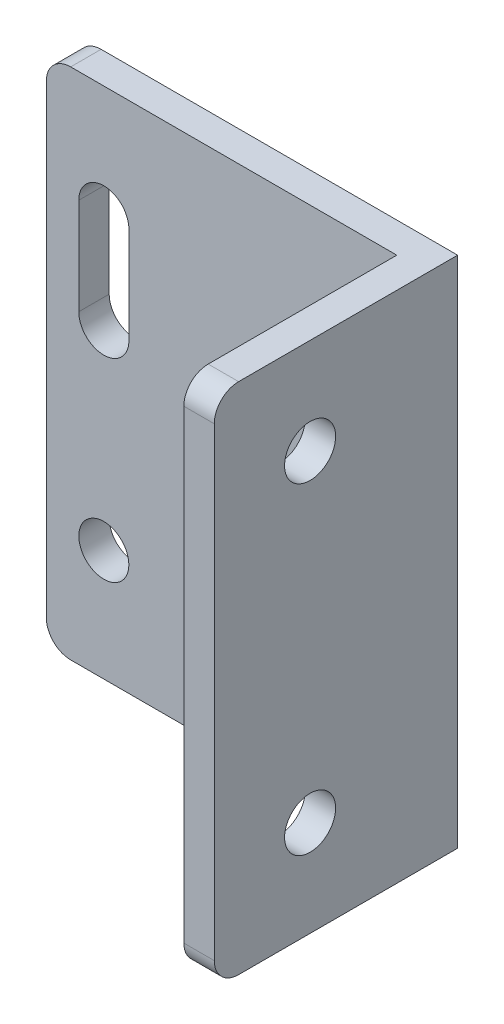
ISO-10303-21;
HEADER;
FILE_DESCRIPTION(('STEP AP214'),'2;1');
FILE_NAME('part.step','',(''),(''),'','','');
FILE_SCHEMA(('AUTOMOTIVE_DESIGN { 1 0 10303 214 1 1 1 1 }'));
ENDSEC;
DATA;
#1=APPLICATION_CONTEXT('core data for automotive mechanical design processes');
#2=APPLICATION_PROTOCOL_DEFINITION('international standard','automotive_design',2000,#1);
#3=PRODUCT_CONTEXT('',#1,'mechanical');
#4=PRODUCT('Part','Part','',(#3));
#5=PRODUCT_RELATED_PRODUCT_CATEGORY('part','',(#4));
#6=PRODUCT_DEFINITION_FORMATION('','',#4);
#7=PRODUCT_DEFINITION_CONTEXT('part definition',#1,'design');
#8=PRODUCT_DEFINITION('design','',#6,#7);
#9=PRODUCT_DEFINITION_SHAPE('','',#8);
#10=(LENGTH_UNIT() NAMED_UNIT(*) SI_UNIT(.MILLI.,.METRE.));
#11=(NAMED_UNIT(*) PLANE_ANGLE_UNIT() SI_UNIT($,.RADIAN.));
#12=(NAMED_UNIT(*) SI_UNIT($,.STERADIAN.) SOLID_ANGLE_UNIT());
#13=UNCERTAINTY_MEASURE_WITH_UNIT(LENGTH_MEASURE(1.E-05),#10,'distance_accuracy_value','');
#14=(GEOMETRIC_REPRESENTATION_CONTEXT(3) GLOBAL_UNCERTAINTY_ASSIGNED_CONTEXT((#13)) GLOBAL_UNIT_ASSIGNED_CONTEXT((#10,
#11,#12)) REPRESENTATION_CONTEXT('',''));
#15=CARTESIAN_POINT('',(0.,0.,0.));
#16=DIRECTION('',(0.,0.,1.));
#17=DIRECTION('',(1.,0.,0.));
#18=AXIS2_PLACEMENT_3D('',#15,#16,#17);
#19=CARTESIAN_POINT('',(-39.750583696,9.99999999999966,15.4));
#20=DIRECTION('',(1.,0.,0.));
#21=DIRECTION('',(0.,0.,-1.));
#22=AXIS2_PLACEMENT_3D('',#19,#20,#21);
#23=CYLINDRICAL_SURFACE('',#22,2.665);
#24=CARTESIAN_POINT('',(-3.175,9.99999999999966,15.4));
#25=DIRECTION('',(1.,0.,0.));
#26=DIRECTION('',(0.,0.,-1.));
#27=AXIS2_PLACEMENT_3D('',#24,#25,#26);
#28=CIRCLE('',#27,2.665);
#29=CARTESIAN_POINT('',(-3.175,9.99999999999966,12.735));
#30=VERTEX_POINT('',#29);
#31=EDGE_CURVE('E20',#30,#30,#28,.F.);
#32=ORIENTED_EDGE('',*,*,#31,.T.);
#33=EDGE_LOOP('',(#32));
#34=FACE_BOUND('',#33,.T.);
#35=CARTESIAN_POINT('',(0.,9.99999999999966,15.4));
#36=DIRECTION('',(1.,0.,0.));
#37=DIRECTION('',(0.,0.,-1.));
#38=AXIS2_PLACEMENT_3D('',#35,#36,#37);
#39=CIRCLE('',#38,2.665);
#40=CARTESIAN_POINT('',(0.,9.99999999999966,12.735));
#41=VERTEX_POINT('',#40);
#42=EDGE_CURVE('E190',#41,#41,#39,.T.);
#43=ORIENTED_EDGE('',*,*,#42,.T.);
#44=EDGE_LOOP('',(#43));
#45=FACE_BOUND('',#44,.T.);
#46=ADVANCED_FACE('F17',(#34,#45),#23,.F.);
#47=CARTESIAN_POINT('',(-39.750583696,43.6,15.4));
#48=DIRECTION('',(1.,0.,0.));
#49=DIRECTION('',(0.,0.,-1.));
#50=AXIS2_PLACEMENT_3D('',#47,#48,#49);
#51=CYLINDRICAL_SURFACE('',#50,2.665);
#52=CARTESIAN_POINT('',(-3.175,43.6,15.4));
#53=DIRECTION('',(1.,0.,0.));
#54=DIRECTION('',(0.,0.,-1.));
#55=AXIS2_PLACEMENT_3D('',#52,#53,#54);
#56=CIRCLE('',#55,2.665);
#57=CARTESIAN_POINT('',(-3.175,43.6,12.735));
#58=VERTEX_POINT('',#57);
#59=EDGE_CURVE('E119',#58,#58,#56,.F.);
#60=ORIENTED_EDGE('',*,*,#59,.T.);
#61=EDGE_LOOP('',(#60));
#62=FACE_BOUND('',#61,.T.);
#63=CARTESIAN_POINT('',(0.,43.6,15.4));
#64=DIRECTION('',(1.,0.,0.));
#65=DIRECTION('',(0.,0.,-1.));
#66=AXIS2_PLACEMENT_3D('',#63,#64,#65);
#67=CIRCLE('',#66,2.665);
#68=CARTESIAN_POINT('',(0.,43.6,12.735));
#69=VERTEX_POINT('',#68);
#70=EDGE_CURVE('E187',#69,#69,#67,.T.);
#71=ORIENTED_EDGE('',*,*,#70,.T.);
#72=EDGE_LOOP('',(#71));
#73=FACE_BOUND('',#72,.T.);
#74=ADVANCED_FACE('F384',(#62,#73),#51,.F.);
#75=CARTESIAN_POINT('',(0.,53.6,25.4));
#76=DIRECTION('',(0.,0.,-1.));
#77=DIRECTION('',(-1.,0.,0.));
#78=AXIS2_PLACEMENT_3D('',#75,#76,#77);
#79=PLANE('',#78);
#80=DIRECTION('',(-1.,0.,0.));
#81=VECTOR('',#80,1.);
#82=CARTESIAN_POINT('',(0.,2.54,25.4));
#83=LINE('',#82,#81);
#84=CARTESIAN_POINT('',(0.,2.54,25.4));
#85=VERTEX_POINT('',#84);
#86=CARTESIAN_POINT('',(-3.175,2.54,25.4));
#87=VERTEX_POINT('',#86);
#88=EDGE_CURVE('E145',#85,#87,#83,.T.);
#89=ORIENTED_EDGE('',*,*,#88,.F.);
#90=DIRECTION('',(0.,1.,0.));
#91=VECTOR('',#90,1.);
#92=CARTESIAN_POINT('',(0.,53.6,25.4));
#93=LINE('',#92,#91);
#94=CARTESIAN_POINT('',(0.,51.06,25.4));
#95=VERTEX_POINT('',#94);
#96=EDGE_CURVE('E185',#85,#95,#93,.T.);
#97=ORIENTED_EDGE('',*,*,#96,.T.);
#98=DIRECTION('',(1.,0.,0.));
#99=VECTOR('',#98,1.);
#100=CARTESIAN_POINT('',(0.,51.06,25.4));
#101=LINE('',#100,#99);
#102=CARTESIAN_POINT('',(-3.175,51.06,25.4));
#103=VERTEX_POINT('',#102);
#104=EDGE_CURVE('E147',#103,#95,#101,.T.);
#105=ORIENTED_EDGE('',*,*,#104,.F.);
#106=DIRECTION('',(0.,1.,0.));
#107=VECTOR('',#106,1.);
#108=CARTESIAN_POINT('',(-3.175,53.6,25.4));
#109=LINE('',#108,#107);
#110=EDGE_CURVE('E116',#103,#87,#109,.F.);
#111=ORIENTED_EDGE('',*,*,#110,.T.);
#112=EDGE_LOOP('',(#89,#97,#105,#111));
#113=FACE_BOUND('',#112,.T.);
#114=ADVANCED_FACE('F376',(#113),#79,.F.);
#115=CARTESIAN_POINT('',(0.,51.06,22.86));
#116=DIRECTION('',(1.,0.,0.));
#117=DIRECTION('',(0.,0.,-1.));
#118=AXIS2_PLACEMENT_3D('',#115,#116,#117);
#119=CYLINDRICAL_SURFACE('',#118,2.54);
#120=CARTESIAN_POINT('',(0.,51.06,22.86));
#121=DIRECTION('',(1.,0.,0.));
#122=DIRECTION('',(0.,0.,-1.));
#123=AXIS2_PLACEMENT_3D('',#120,#121,#122);
#124=CIRCLE('',#123,2.54);
#125=CARTESIAN_POINT('',(0.,53.6,22.86));
#126=VERTEX_POINT('',#125);
#127=EDGE_CURVE('E135',#95,#126,#124,.F.);
#128=ORIENTED_EDGE('',*,*,#127,.T.);
#129=DIRECTION('',(1.,0.,0.));
#130=VECTOR('',#129,1.);
#131=CARTESIAN_POINT('',(0.,53.6,22.86));
#132=LINE('',#131,#130);
#133=CARTESIAN_POINT('',(-3.175,53.6,22.86));
#134=VERTEX_POINT('',#133);
#135=EDGE_CURVE('E126',#126,#134,#132,.F.);
#136=ORIENTED_EDGE('',*,*,#135,.T.);
#137=CARTESIAN_POINT('',(-3.175,51.06,22.86));
#138=DIRECTION('',(1.,0.,0.));
#139=DIRECTION('',(0.,0.,-1.));
#140=AXIS2_PLACEMENT_3D('',#137,#138,#139);
#141=CIRCLE('',#140,2.54);
#142=EDGE_CURVE('E108',#134,#103,#141,.T.);
#143=ORIENTED_EDGE('',*,*,#142,.T.);
#144=ORIENTED_EDGE('',*,*,#104,.T.);
#145=EDGE_LOOP('',(#128,#136,#143,#144));
#146=FACE_BOUND('',#145,.T.);
#147=ADVANCED_FACE('F133',(#146),#119,.T.);
#148=CARTESIAN_POINT('',(0.,2.54,22.86));
#149=DIRECTION('',(-1.,0.,0.));
#150=DIRECTION('',(0.,0.,1.));
#151=AXIS2_PLACEMENT_3D('',#148,#149,#150);
#152=CYLINDRICAL_SURFACE('',#151,2.54);
#153=CARTESIAN_POINT('',(0.,2.54,22.86));
#154=DIRECTION('',(-1.,0.,0.));
#155=DIRECTION('',(0.,0.,1.));
#156=AXIS2_PLACEMENT_3D('',#153,#154,#155);
#157=CIRCLE('',#156,2.54);
#158=CARTESIAN_POINT('',(0.,0.,22.86));
#159=VERTEX_POINT('',#158);
#160=EDGE_CURVE('E182',#159,#85,#157,.T.);
#161=ORIENTED_EDGE('',*,*,#160,.T.);
#162=ORIENTED_EDGE('',*,*,#88,.T.);
#163=CARTESIAN_POINT('',(-3.175,2.54,22.86));
#164=DIRECTION('',(-1.,0.,0.));
#165=DIRECTION('',(0.,0.,1.));
#166=AXIS2_PLACEMENT_3D('',#163,#164,#165);
#167=CIRCLE('',#166,2.54);
#168=CARTESIAN_POINT('',(-3.175,0.,22.86));
#169=VERTEX_POINT('',#168);
#170=EDGE_CURVE('E201',#87,#169,#167,.F.);
#171=ORIENTED_EDGE('',*,*,#170,.T.);
#172=DIRECTION('',(1.,0.,0.));
#173=VECTOR('',#172,1.);
#174=CARTESIAN_POINT('',(0.,0.,22.86));
#175=LINE('',#174,#173);
#176=EDGE_CURVE('E416',#159,#169,#175,.F.);
#177=ORIENTED_EDGE('',*,*,#176,.F.);
#178=EDGE_LOOP('',(#161,#162,#171,#177));
#179=FACE_BOUND('',#178,.T.);
#180=ADVANCED_FACE('F213',(#179),#152,.T.);
#181=CARTESIAN_POINT('',(-3.175,53.6,3.175));
#182=DIRECTION('',(1.,0.,0.));
#183=DIRECTION('',(0.,0.,-1.));
#184=AXIS2_PLACEMENT_3D('',#181,#182,#183);
#185=PLANE('',#184);
#186=ORIENTED_EDGE('',*,*,#170,.F.);
#187=ORIENTED_EDGE('',*,*,#110,.F.);
#188=ORIENTED_EDGE('',*,*,#142,.F.);
#189=DIRECTION('',(0.,0.,-1.));
#190=VECTOR('',#189,1.);
#191=CARTESIAN_POINT('',(-3.175,53.6,0.));
#192=LINE('',#191,#190);
#193=CARTESIAN_POINT('',(-3.175,53.6,3.175));
#194=VERTEX_POINT('',#193);
#195=EDGE_CURVE('E114',#134,#194,#192,.T.);
#196=ORIENTED_EDGE('',*,*,#195,.T.);
#197=DIRECTION('',(0.,1.,0.));
#198=VECTOR('',#197,1.);
#199=CARTESIAN_POINT('',(-3.175,53.6,3.175));
#200=LINE('',#199,#198);
#201=CARTESIAN_POINT('',(-3.175,0.,3.175));
#202=VERTEX_POINT('',#201);
#203=EDGE_CURVE('E200',#194,#202,#200,.F.);
#204=ORIENTED_EDGE('',*,*,#203,.T.);
#205=DIRECTION('',(0.,0.,-1.));
#206=VECTOR('',#205,1.);
#207=CARTESIAN_POINT('',(-3.175,0.,0.));
#208=LINE('',#207,#206);
#209=EDGE_CURVE('E419',#169,#202,#208,.T.);
#210=ORIENTED_EDGE('',*,*,#209,.F.);
#211=EDGE_LOOP('',(#186,#187,#188,#196,#204,#210));
#212=FACE_BOUND('',#211,.T.);
#213=ORIENTED_EDGE('',*,*,#59,.F.);
#214=EDGE_LOOP('',(#213));
#215=FACE_BOUND('',#214,.T.);
#216=ORIENTED_EDGE('',*,*,#31,.F.);
#217=EDGE_LOOP('',(#216));
#218=FACE_BOUND('',#217,.T.);
#219=ADVANCED_FACE('F111',(#212,#215,#218),#185,.F.);
#220=CARTESIAN_POINT('',(-3.175,53.6,3.175));
#221=DIRECTION('',(0.,0.,-1.));
#222=DIRECTION('',(-1.,0.,0.));
#223=AXIS2_PLACEMENT_3D('',#220,#221,#222);
#224=PLANE('',#223);
#225=CARTESIAN_POINT('',(-37.209583696,2.54,3.175));
#226=DIRECTION('',(0.,0.,-1.));
#227=DIRECTION('',(-1.,0.,0.));
#228=AXIS2_PLACEMENT_3D('',#225,#226,#227);
#229=CIRCLE('',#228,2.54);
#230=CARTESIAN_POINT('',(-37.209583696,0.,3.175));
#231=VERTEX_POINT('',#230);
#232=CARTESIAN_POINT('',(-39.749583696,2.54,3.175));
#233=VERTEX_POINT('',#232);
#234=EDGE_CURVE('E176',#231,#233,#229,.T.);
#235=ORIENTED_EDGE('',*,*,#234,.F.);
#236=DIRECTION('',(1.,0.,0.));
#237=VECTOR('',#236,1.);
#238=CARTESIAN_POINT('',(0.,0.,3.175));
#239=LINE('',#238,#237);
#240=EDGE_CURVE('E422',#202,#231,#239,.F.);
#241=ORIENTED_EDGE('',*,*,#240,.F.);
#242=ORIENTED_EDGE('',*,*,#203,.F.);
#243=DIRECTION('',(1.,0.,0.));
#244=VECTOR('',#243,1.);
#245=CARTESIAN_POINT('',(0.,53.6,3.175));
#246=LINE('',#245,#244);
#247=CARTESIAN_POINT('',(-37.209583696,53.6,3.175));
#248=VERTEX_POINT('',#247);
#249=EDGE_CURVE('E130',#194,#248,#246,.F.);
#250=ORIENTED_EDGE('',*,*,#249,.T.);
#251=CARTESIAN_POINT('',(-37.209583696,51.06,3.175));
#252=DIRECTION('',(0.,0.,1.));
#253=DIRECTION('',(1.,0.,0.));
#254=AXIS2_PLACEMENT_3D('',#251,#252,#253);
#255=CIRCLE('',#254,2.54);
#256=CARTESIAN_POINT('',(-39.749583696,51.06,3.175));
#257=VERTEX_POINT('',#256);
#258=EDGE_CURVE('E131',#257,#248,#255,.F.);
#259=ORIENTED_EDGE('',*,*,#258,.F.);
#260=DIRECTION('',(0.,1.,0.));
#261=VECTOR('',#260,1.);
#262=CARTESIAN_POINT('',(-39.749583696,53.6,3.175));
#263=LINE('',#262,#261);
#264=EDGE_CURVE('E179',#257,#233,#263,.F.);
#265=ORIENTED_EDGE('',*,*,#264,.T.);
#266=EDGE_LOOP('',(#235,#241,#242,#250,#259,#265));
#267=FACE_BOUND('',#266,.T.);
#268=CARTESIAN_POINT('',(-33.749595696,41.9681255030278,3.175));
#269=DIRECTION('',(0.,0.,1.));
#270=DIRECTION('',(1.,0.,0.));
#271=AXIS2_PLACEMENT_3D('',#268,#269,#270);
#272=CIRCLE('',#271,2.61619999999999);
#273=CARTESIAN_POINT('',(-36.365795696,41.9681255030278,3.175));
#274=VERTEX_POINT('',#273);
#275=CARTESIAN_POINT('',(-31.133395696,41.9681255030278,3.175));
#276=VERTEX_POINT('',#275);
#277=EDGE_CURVE('E193',#274,#276,#272,.F.);
#278=ORIENTED_EDGE('',*,*,#277,.T.);
#279=DIRECTION('',(0.,1.,0.));
#280=VECTOR('',#279,1.);
#281=CARTESIAN_POINT('',(-31.133395696,41.9681255030278,3.175));
#282=LINE('',#281,#280);
#283=CARTESIAN_POINT('',(-31.133395696,31.893153179725,3.175));
#284=VERTEX_POINT('',#283);
#285=EDGE_CURVE('E149',#276,#284,#282,.F.);
#286=ORIENTED_EDGE('',*,*,#285,.T.);
#287=CARTESIAN_POINT('',(-33.749595696,31.893153179725,3.175));
#288=DIRECTION('',(0.,0.,1.));
#289=DIRECTION('',(1.,0.,0.));
#290=AXIS2_PLACEMENT_3D('',#287,#288,#289);
#291=CIRCLE('',#290,2.61619999999999);
#292=CARTESIAN_POINT('',(-36.365795696,31.893153179725,3.175));
#293=VERTEX_POINT('',#292);
#294=EDGE_CURVE('E195',#284,#293,#291,.F.);
#295=ORIENTED_EDGE('',*,*,#294,.T.);
#296=DIRECTION('',(0.,1.,0.));
#297=VECTOR('',#296,1.);
#298=CARTESIAN_POINT('',(-36.365795696,31.893153179725,3.175));
#299=LINE('',#298,#297);
#300=EDGE_CURVE('E154',#293,#274,#299,.T.);
#301=ORIENTED_EDGE('',*,*,#300,.T.);
#302=EDGE_LOOP('',(#278,#286,#295,#301));
#303=FACE_BOUND('',#302,.T.);
#304=CARTESIAN_POINT('',(-33.749595696,11.6318744971157,3.175));
#305=DIRECTION('',(0.,0.,1.));
#306=DIRECTION('',(1.,0.,0.));
#307=AXIS2_PLACEMENT_3D('',#304,#305,#306);
#308=CIRCLE('',#307,2.60985);
#309=CARTESIAN_POINT('',(-31.139745696,11.6318744971157,3.175));
#310=VERTEX_POINT('',#309);
#311=EDGE_CURVE('E197',#310,#310,#308,.F.);
#312=ORIENTED_EDGE('',*,*,#311,.T.);
#313=EDGE_LOOP('',(#312));
#314=FACE_BOUND('',#313,.T.);
#315=ADVANCED_FACE('F212',(#267,#303,#314),#224,.F.);
#316=CARTESIAN_POINT('',(-33.749595696,11.6318744971157,-0.00100000000000013));
#317=DIRECTION('',(0.,0.,1.));
#318=DIRECTION('',(1.,0.,0.));
#319=AXIS2_PLACEMENT_3D('',#316,#317,#318);
#320=CYLINDRICAL_SURFACE('',#319,2.60985);
#321=ORIENTED_EDGE('',*,*,#311,.F.);
#322=EDGE_LOOP('',(#321));
#323=FACE_BOUND('',#322,.T.);
#324=CARTESIAN_POINT('',(-33.749595696,11.6318744971157,0.));
#325=DIRECTION('',(0.,0.,1.));
#326=DIRECTION('',(1.,0.,0.));
#327=AXIS2_PLACEMENT_3D('',#324,#325,#326);
#328=CIRCLE('',#327,2.60985);
#329=CARTESIAN_POINT('',(-31.139745696,11.6318744971157,0.));
#330=VERTEX_POINT('',#329);
#331=EDGE_CURVE('E173',#330,#330,#328,.F.);
#332=ORIENTED_EDGE('',*,*,#331,.T.);
#333=EDGE_LOOP('',(#332));
#334=FACE_BOUND('',#333,.T.);
#335=ADVANCED_FACE('F220',(#323,#334),#320,.F.);
#336=CARTESIAN_POINT('',(-33.749595696,31.893153179725,-0.00100000000000013));
#337=DIRECTION('',(0.,0.,1.));
#338=DIRECTION('',(1.,0.,0.));
#339=AXIS2_PLACEMENT_3D('',#336,#337,#338);
#340=CYLINDRICAL_SURFACE('',#339,2.61619999999999);
#341=DIRECTION('',(0.,0.,1.));
#342=VECTOR('',#341,1.);
#343=CARTESIAN_POINT('',(-36.365795696,31.893153179725,-0.00100000000000013));
#344=LINE('',#343,#342);
#345=CARTESIAN_POINT('',(-36.365795696,31.893153179725,0.));
#346=VERTEX_POINT('',#345);
#347=EDGE_CURVE('E157',#346,#293,#344,.T.);
#348=ORIENTED_EDGE('',*,*,#347,.T.);
#349=ORIENTED_EDGE('',*,*,#294,.F.);
#350=DIRECTION('',(0.,0.,-1.));
#351=VECTOR('',#350,1.);
#352=CARTESIAN_POINT('',(-31.133395696,31.893153179725,-0.00100000000000013));
#353=LINE('',#352,#351);
#354=CARTESIAN_POINT('',(-31.133395696,31.893153179725,0.));
#355=VERTEX_POINT('',#354);
#356=EDGE_CURVE('E152',#284,#355,#353,.T.);
#357=ORIENTED_EDGE('',*,*,#356,.T.);
#358=CARTESIAN_POINT('',(-33.749595696,31.893153179725,0.));
#359=DIRECTION('',(0.,0.,1.));
#360=DIRECTION('',(1.,0.,0.));
#361=AXIS2_PLACEMENT_3D('',#358,#359,#360);
#362=CIRCLE('',#361,2.61619999999999);
#363=EDGE_CURVE('E170',#355,#346,#362,.F.);
#364=ORIENTED_EDGE('',*,*,#363,.T.);
#365=EDGE_LOOP('',(#348,#349,#357,#364));
#366=FACE_BOUND('',#365,.T.);
#367=ADVANCED_FACE('F266',(#366),#340,.F.);
#368=CARTESIAN_POINT('',(-36.365795696,31.893153179725,-0.00100000000000013));
#369=DIRECTION('',(-1.,0.,0.));
#370=DIRECTION('',(0.,0.,1.));
#371=AXIS2_PLACEMENT_3D('',#368,#369,#370);
#372=PLANE('',#371);
#373=DIRECTION('',(0.,0.,1.));
#374=VECTOR('',#373,1.);
#375=CARTESIAN_POINT('',(-36.365795696,41.9681255030278,-0.00100000000000013));
#376=LINE('',#375,#374);
#377=CARTESIAN_POINT('',(-36.365795696,41.9681255030278,0.));
#378=VERTEX_POINT('',#377);
#379=EDGE_CURVE('E156',#378,#274,#376,.T.);
#380=ORIENTED_EDGE('',*,*,#379,.T.);
#381=ORIENTED_EDGE('',*,*,#300,.F.);
#382=ORIENTED_EDGE('',*,*,#347,.F.);
#383=DIRECTION('',(0.,1.,0.));
#384=VECTOR('',#383,1.);
#385=CARTESIAN_POINT('',(-36.365795696,53.6,0.));
#386=LINE('',#385,#384);
#387=EDGE_CURVE('E169',#346,#378,#386,.T.);
#388=ORIENTED_EDGE('',*,*,#387,.T.);
#389=EDGE_LOOP('',(#380,#381,#382,#388));
#390=FACE_BOUND('',#389,.T.);
#391=ADVANCED_FACE('F262',(#390),#372,.F.);
#392=CARTESIAN_POINT('',(-33.749595696,41.9681255030278,-0.00100000000000013));
#393=DIRECTION('',(0.,0.,1.));
#394=DIRECTION('',(1.,0.,0.));
#395=AXIS2_PLACEMENT_3D('',#392,#393,#394);
#396=CYLINDRICAL_SURFACE('',#395,2.61619999999999);
#397=DIRECTION('',(0.,0.,-1.));
#398=VECTOR('',#397,1.);
#399=CARTESIAN_POINT('',(-31.133395696,41.9681255030278,-0.00100000000000013));
#400=LINE('',#399,#398);
#401=CARTESIAN_POINT('',(-31.133395696,41.9681255030278,0.));
#402=VERTEX_POINT('',#401);
#403=EDGE_CURVE('E153',#402,#276,#400,.F.);
#404=ORIENTED_EDGE('',*,*,#403,.T.);
#405=ORIENTED_EDGE('',*,*,#277,.F.);
#406=ORIENTED_EDGE('',*,*,#379,.F.);
#407=CARTESIAN_POINT('',(-33.749595696,41.9681255030278,0.));
#408=DIRECTION('',(0.,0.,1.));
#409=DIRECTION('',(1.,0.,0.));
#410=AXIS2_PLACEMENT_3D('',#407,#408,#409);
#411=CIRCLE('',#410,2.61619999999999);
#412=EDGE_CURVE('E165',#378,#402,#411,.F.);
#413=ORIENTED_EDGE('',*,*,#412,.T.);
#414=EDGE_LOOP('',(#404,#405,#406,#413));
#415=FACE_BOUND('',#414,.T.);
#416=ADVANCED_FACE('F258',(#415),#396,.F.);
#417=CARTESIAN_POINT('',(-31.133395696,41.9681255030278,-0.00100000000000013));
#418=DIRECTION('',(1.,0.,0.));
#419=DIRECTION('',(0.,0.,-1.));
#420=AXIS2_PLACEMENT_3D('',#417,#418,#419);
#421=PLANE('',#420);
#422=ORIENTED_EDGE('',*,*,#356,.F.);
#423=ORIENTED_EDGE('',*,*,#285,.F.);
#424=ORIENTED_EDGE('',*,*,#403,.F.);
#425=DIRECTION('',(0.,1.,0.));
#426=VECTOR('',#425,1.);
#427=CARTESIAN_POINT('',(-31.133395696,53.6,0.));
#428=LINE('',#427,#426);
#429=EDGE_CURVE('E168',#402,#355,#428,.F.);
#430=ORIENTED_EDGE('',*,*,#429,.T.);
#431=EDGE_LOOP('',(#422,#423,#424,#430));
#432=FACE_BOUND('',#431,.T.);
#433=ADVANCED_FACE('F254',(#432),#421,.F.);
#434=CARTESIAN_POINT('',(0.,53.6,0.));
#435=DIRECTION('',(-1.,0.,0.));
#436=DIRECTION('',(0.,0.,1.));
#437=AXIS2_PLACEMENT_3D('',#434,#435,#436);
#438=PLANE('',#437);
#439=ORIENTED_EDGE('',*,*,#160,.F.);
#440=DIRECTION('',(0.,0.,-1.));
#441=VECTOR('',#440,1.);
#442=CARTESIAN_POINT('',(0.,0.,0.));
#443=LINE('',#442,#441);
#444=CARTESIAN_POINT('',(0.,0.,0.));
#445=VERTEX_POINT('',#444);
#446=EDGE_CURVE('E420',#445,#159,#443,.F.);
#447=ORIENTED_EDGE('',*,*,#446,.F.);
#448=DIRECTION('',(0.,1.,0.));
#449=VECTOR('',#448,1.);
#450=CARTESIAN_POINT('',(0.,53.6,0.));
#451=LINE('',#450,#449);
#452=CARTESIAN_POINT('',(0.,53.6,0.));
#453=VERTEX_POINT('',#452);
#454=EDGE_CURVE('E467',#445,#453,#451,.T.);
#455=ORIENTED_EDGE('',*,*,#454,.T.);
#456=DIRECTION('',(0.,0.,-1.));
#457=VECTOR('',#456,1.);
#458=CARTESIAN_POINT('',(0.,53.6,0.));
#459=LINE('',#458,#457);
#460=EDGE_CURVE('E136',#453,#126,#459,.F.);
#461=ORIENTED_EDGE('',*,*,#460,.T.);
#462=ORIENTED_EDGE('',*,*,#127,.F.);
#463=ORIENTED_EDGE('',*,*,#96,.F.);
#464=EDGE_LOOP('',(#439,#447,#455,#461,#462,#463));
#465=FACE_BOUND('',#464,.T.);
#466=ORIENTED_EDGE('',*,*,#70,.F.);
#467=EDGE_LOOP('',(#466));
#468=FACE_BOUND('',#467,.T.);
#469=ORIENTED_EDGE('',*,*,#42,.F.);
#470=EDGE_LOOP('',(#469));
#471=FACE_BOUND('',#470,.T.);
#472=ADVANCED_FACE('F251',(#465,#468,#471),#438,.F.);
#473=CARTESIAN_POINT('',(0.,53.6,0.));
#474=DIRECTION('',(0.,-1.,0.));
#475=DIRECTION('',(0.,0.,-1.));
#476=AXIS2_PLACEMENT_3D('',#473,#474,#475);
#477=PLANE('',#476);
#478=ORIENTED_EDGE('',*,*,#135,.F.);
#479=ORIENTED_EDGE('',*,*,#460,.F.);
#480=DIRECTION('',(1.,0.,0.));
#481=VECTOR('',#480,1.);
#482=CARTESIAN_POINT('',(0.,53.6,0.));
#483=LINE('',#482,#481);
#484=CARTESIAN_POINT('',(-37.209583696,53.6,0.));
#485=VERTEX_POINT('',#484);
#486=EDGE_CURVE('E164',#453,#485,#483,.F.);
#487=ORIENTED_EDGE('',*,*,#486,.T.);
#488=DIRECTION('',(0.,0.,1.));
#489=VECTOR('',#488,1.);
#490=CARTESIAN_POINT('',(-37.209583696,53.6,0.));
#491=LINE('',#490,#489);
#492=EDGE_CURVE('E181',#248,#485,#491,.F.);
#493=ORIENTED_EDGE('',*,*,#492,.F.);
#494=ORIENTED_EDGE('',*,*,#249,.F.);
#495=ORIENTED_EDGE('',*,*,#195,.F.);
#496=EDGE_LOOP('',(#478,#479,#487,#493,#494,#495));
#497=FACE_BOUND('',#496,.T.);
#498=ADVANCED_FACE('F124',(#497),#477,.F.);
#499=CARTESIAN_POINT('',(-37.209583696,51.06,0.));
#500=DIRECTION('',(0.,0.,1.));
#501=DIRECTION('',(1.,0.,0.));
#502=AXIS2_PLACEMENT_3D('',#499,#500,#501);
#503=CYLINDRICAL_SURFACE('',#502,2.54);
#504=ORIENTED_EDGE('',*,*,#258,.T.);
#505=ORIENTED_EDGE('',*,*,#492,.T.);
#506=CARTESIAN_POINT('',(-37.209583696,51.06,0.));
#507=DIRECTION('',(0.,0.,1.));
#508=DIRECTION('',(1.,0.,0.));
#509=AXIS2_PLACEMENT_3D('',#506,#507,#508);
#510=CIRCLE('',#509,2.54);
#511=CARTESIAN_POINT('',(-39.749583696,51.06,0.));
#512=VERTEX_POINT('',#511);
#513=EDGE_CURVE('E161',#485,#512,#510,.T.);
#514=ORIENTED_EDGE('',*,*,#513,.T.);
#515=DIRECTION('',(0.,0.,1.));
#516=VECTOR('',#515,1.);
#517=CARTESIAN_POINT('',(-39.749583696,51.06,-0.00100000000000013));
#518=LINE('',#517,#516);
#519=EDGE_CURVE('E429',#512,#257,#518,.T.);
#520=ORIENTED_EDGE('',*,*,#519,.T.);
#521=EDGE_LOOP('',(#504,#505,#514,#520));
#522=FACE_BOUND('',#521,.T.);
#523=ADVANCED_FACE('F244',(#522),#503,.T.);
#524=CARTESIAN_POINT('',(-39.749583696,53.6,-0.00100000000000013));
#525=DIRECTION('',(1.,0.,0.));
#526=DIRECTION('',(0.,1.,0.));
#527=AXIS2_PLACEMENT_3D('',#524,#525,#526);
#528=PLANE('',#527);
#529=DIRECTION('',(0.,0.,-1.));
#530=VECTOR('',#529,1.);
#531=CARTESIAN_POINT('',(-39.749583696,2.54,-0.00100000000000013));
#532=LINE('',#531,#530);
#533=CARTESIAN_POINT('',(-39.749583696,2.54,0.));
#534=VERTEX_POINT('',#533);
#535=EDGE_CURVE('E178',#233,#534,#532,.T.);
#536=ORIENTED_EDGE('',*,*,#535,.F.);
#537=ORIENTED_EDGE('',*,*,#264,.F.);
#538=ORIENTED_EDGE('',*,*,#519,.F.);
#539=DIRECTION('',(0.,1.,0.));
#540=VECTOR('',#539,1.);
#541=CARTESIAN_POINT('',(-39.749583696,53.6,0.));
#542=LINE('',#541,#540);
#543=EDGE_CURVE('E160',#512,#534,#542,.F.);
#544=ORIENTED_EDGE('',*,*,#543,.T.);
#545=EDGE_LOOP('',(#536,#537,#538,#544));
#546=FACE_BOUND('',#545,.T.);
#547=ADVANCED_FACE('F240',(#546),#528,.F.);
#548=CARTESIAN_POINT('',(-37.209583696,2.54,-0.00100000000000013));
#549=DIRECTION('',(0.,0.,-1.));
#550=DIRECTION('',(-1.,0.,0.));
#551=AXIS2_PLACEMENT_3D('',#548,#549,#550);
#552=CYLINDRICAL_SURFACE('',#551,2.54);
#553=ORIENTED_EDGE('',*,*,#234,.T.);
#554=ORIENTED_EDGE('',*,*,#535,.T.);
#555=CARTESIAN_POINT('',(-37.209583696,2.54,0.));
#556=DIRECTION('',(0.,0.,-1.));
#557=DIRECTION('',(-1.,0.,0.));
#558=AXIS2_PLACEMENT_3D('',#555,#556,#557);
#559=CIRCLE('',#558,2.54);
#560=CARTESIAN_POINT('',(-37.209583696,0.,0.));
#561=VERTEX_POINT('',#560);
#562=EDGE_CURVE('E26',#534,#561,#559,.F.);
#563=ORIENTED_EDGE('',*,*,#562,.T.);
#564=DIRECTION('',(0.,0.,-1.));
#565=VECTOR('',#564,1.);
#566=CARTESIAN_POINT('',(-37.209583696,0.,0.));
#567=LINE('',#566,#565);
#568=EDGE_CURVE('E34',#231,#561,#567,.T.);
#569=ORIENTED_EDGE('',*,*,#568,.F.);
#570=EDGE_LOOP('',(#553,#554,#563,#569));
#571=FACE_BOUND('',#570,.T.);
#572=ADVANCED_FACE('F233',(#571),#552,.T.);
#573=CARTESIAN_POINT('',(0.,0.,0.));
#574=DIRECTION('',(0.,-1.,0.));
#575=DIRECTION('',(0.,0.,-1.));
#576=AXIS2_PLACEMENT_3D('',#573,#574,#575);
#577=PLANE('',#576);
#578=ORIENTED_EDGE('',*,*,#568,.T.);
#579=DIRECTION('',(1.,0.,0.));
#580=VECTOR('',#579,1.);
#581=CARTESIAN_POINT('',(0.,0.,0.));
#582=LINE('',#581,#580);
#583=EDGE_CURVE('E11',#561,#445,#582,.T.);
#584=ORIENTED_EDGE('',*,*,#583,.T.);
#585=ORIENTED_EDGE('',*,*,#446,.T.);
#586=ORIENTED_EDGE('',*,*,#176,.T.);
#587=ORIENTED_EDGE('',*,*,#209,.T.);
#588=ORIENTED_EDGE('',*,*,#240,.T.);
#589=EDGE_LOOP('',(#578,#584,#585,#586,#587,#588));
#590=FACE_BOUND('',#589,.T.);
#591=ADVANCED_FACE('F227',(#590),#577,.T.);
#592=CARTESIAN_POINT('',(0.,53.6,0.));
#593=DIRECTION('',(0.,0.,1.));
#594=DIRECTION('',(1.,0.,0.));
#595=AXIS2_PLACEMENT_3D('',#592,#593,#594);
#596=PLANE('',#595);
#597=ORIENTED_EDGE('',*,*,#562,.F.);
#598=ORIENTED_EDGE('',*,*,#543,.F.);
#599=ORIENTED_EDGE('',*,*,#513,.F.);
#600=ORIENTED_EDGE('',*,*,#486,.F.);
#601=ORIENTED_EDGE('',*,*,#454,.F.);
#602=ORIENTED_EDGE('',*,*,#583,.F.);
#603=EDGE_LOOP('',(#597,#598,#599,#600,#601,#602));
#604=FACE_BOUND('',#603,.T.);
#605=ORIENTED_EDGE('',*,*,#412,.F.);
#606=ORIENTED_EDGE('',*,*,#387,.F.);
#607=ORIENTED_EDGE('',*,*,#363,.F.);
#608=ORIENTED_EDGE('',*,*,#429,.F.);
#609=EDGE_LOOP('',(#605,#606,#607,#608));
#610=FACE_BOUND('',#609,.T.);
#611=ORIENTED_EDGE('',*,*,#331,.F.);
#612=EDGE_LOOP('',(#611));
#613=FACE_BOUND('',#612,.T.);
#614=ADVANCED_FACE('F225',(#604,#610,#613),#596,.F.);
#615=CLOSED_SHELL('',(#46,#74,#114,#147,#180,#219,#315,#335,#367,#391,#416,#433,#472,#498,#523,
#547,#572,#591,#614));
#616=MANIFOLD_SOLID_BREP('B1',#615);
#617=ADVANCED_BREP_SHAPE_REPRESENTATION('',(#18,#616),#14);
#618=SHAPE_DEFINITION_REPRESENTATION(#9,#617);
ENDSEC;
END-ISO-10303-21;
